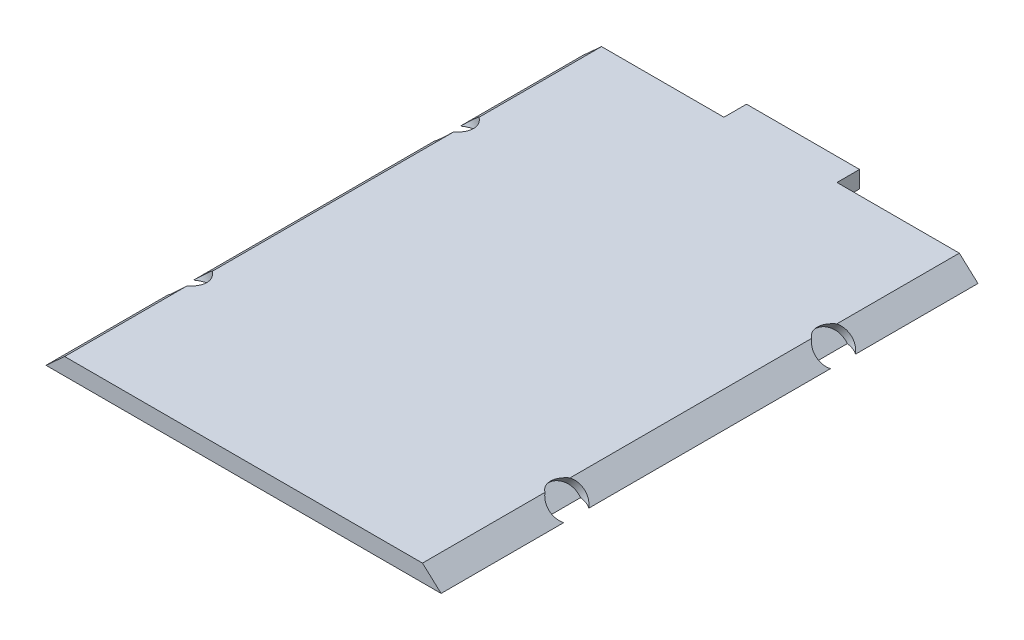
ISO-10303-21;
HEADER;
FILE_DESCRIPTION(('STEP AP214'),'2;1');
FILE_NAME('part.step','',(''),(''),'','','');
FILE_SCHEMA(('AUTOMOTIVE_DESIGN { 1 0 10303 214 1 1 1 1 }'));
ENDSEC;
DATA;
#1=APPLICATION_CONTEXT('core data for automotive mechanical design processes');
#2=APPLICATION_PROTOCOL_DEFINITION('international standard','automotive_design',2000,#1);
#3=PRODUCT_CONTEXT('',#1,'mechanical');
#4=PRODUCT('Part','Part','',(#3));
#5=PRODUCT_RELATED_PRODUCT_CATEGORY('part','',(#4));
#6=PRODUCT_DEFINITION_FORMATION('','',#4);
#7=PRODUCT_DEFINITION_CONTEXT('part definition',#1,'design');
#8=PRODUCT_DEFINITION('design','',#6,#7);
#9=PRODUCT_DEFINITION_SHAPE('','',#8);
#10=(LENGTH_UNIT() NAMED_UNIT(*) SI_UNIT(.MILLI.,.METRE.));
#11=(NAMED_UNIT(*) PLANE_ANGLE_UNIT() SI_UNIT($,.RADIAN.));
#12=(NAMED_UNIT(*) SI_UNIT($,.STERADIAN.) SOLID_ANGLE_UNIT());
#13=UNCERTAINTY_MEASURE_WITH_UNIT(LENGTH_MEASURE(1.E-05),#10,'distance_accuracy_value','');
#14=(GEOMETRIC_REPRESENTATION_CONTEXT(3) GLOBAL_UNCERTAINTY_ASSIGNED_CONTEXT((#13)) GLOBAL_UNIT_ASSIGNED_CONTEXT((#10,
#11,#12)) REPRESENTATION_CONTEXT('',''));
#15=CARTESIAN_POINT('',(0.,0.,0.));
#16=DIRECTION('',(0.,0.,1.));
#17=DIRECTION('',(1.,0.,0.));
#18=AXIS2_PLACEMENT_3D('',#15,#16,#17);
#19=CARTESIAN_POINT('',(40.2038837694651,5.93778829627168,120.65));
#20=DIRECTION('',(-0.672307408747508,-0.740272077106257,0.));
#21=DIRECTION('',(0.740272077106257,-0.672307408747508,0.));
#22=AXIS2_PLACEMENT_3D('',#19,#20,#21);
#23=PLANE('',#22);
#24=DIRECTION('',(0.,0.,-1.));
#25=VECTOR('',#24,1.);
#26=CARTESIAN_POINT('',(44.39904297354,2.12778829627168,120.65));
#27=LINE('',#26,#25);
#28=CARTESIAN_POINT('',(44.39904297354,2.12778829627169,87.4736801787405));
#29=VERTEX_POINT('',#28);
#30=CARTESIAN_POINT('',(44.39904297354,2.12778829627169,33.1763198212595));
#31=VERTEX_POINT('',#30);
#32=EDGE_CURVE('E191',#29,#31,#27,.T.);
#33=ORIENTED_EDGE('',*,*,#32,.T.);
#34=CARTESIAN_POINT('',(42.3014633715025,4.03278829627169,30.353));
#35=DIRECTION('',(0.672307408747507,0.740272077106257,0.));
#36=DIRECTION('',(0.740272077106257,-0.672307408747507,0.));
#37=AXIS2_PLACEMENT_3D('',#34,#35,#36);
#38=CIRCLE('',#37,4.00000000000002);
#39=CARTESIAN_POINT('',(40.2038837694651,5.93778829627168,33.1763198212595));
#40=VERTEX_POINT('',#39);
#41=EDGE_CURVE('E184',#40,#31,#38,.T.);
#42=ORIENTED_EDGE('',*,*,#41,.F.);
#43=DIRECTION('',(0.,0.,-1.));
#44=VECTOR('',#43,1.);
#45=CARTESIAN_POINT('',(40.2038837694651,5.93778829627168,120.65));
#46=LINE('',#45,#44);
#47=CARTESIAN_POINT('',(40.2038837694651,5.93778829627168,87.4736801787405));
#48=VERTEX_POINT('',#47);
#49=EDGE_CURVE('E197',#48,#40,#46,.T.);
#50=ORIENTED_EDGE('',*,*,#49,.F.);
#51=CARTESIAN_POINT('',(42.3014633715025,4.03278829627169,90.297));
#52=DIRECTION('',(0.672307408747507,0.740272077106257,0.));
#53=DIRECTION('',(-0.740272077106257,0.672307408747507,0.));
#54=AXIS2_PLACEMENT_3D('',#51,#52,#53);
#55=CIRCLE('',#54,4.00000000000002);
#56=EDGE_CURVE('E56',#29,#48,#55,.T.);
#57=ORIENTED_EDGE('',*,*,#56,.F.);
#58=EDGE_LOOP('',(#33,#42,#50,#57));
#59=FACE_BOUND('',#58,.T.);
#60=ADVANCED_FACE('F33',(#59),#23,.F.);
#61=CARTESIAN_POINT('',(44.39904297354,2.12778829627168,120.65));
#62=VERTEX_POINT('',#61);
#63=CARTESIAN_POINT('',(44.39904297354,2.12778829627169,93.1203198212595));
#64=VERTEX_POINT('',#63);
#65=EDGE_CURVE('E194',#62,#64,#27,.T.);
#66=ORIENTED_EDGE('',*,*,#65,.T.);
#67=CARTESIAN_POINT('',(40.2038837694651,5.93778829627168,93.1203198212595));
#68=VERTEX_POINT('',#67);
#69=EDGE_CURVE('E247',#68,#64,#55,.T.);
#70=ORIENTED_EDGE('',*,*,#69,.F.);
#71=CARTESIAN_POINT('',(40.2038837694651,5.93778829627168,120.65));
#72=VERTEX_POINT('',#71);
#73=EDGE_CURVE('E192',#72,#68,#46,.T.);
#74=ORIENTED_EDGE('',*,*,#73,.F.);
#75=DIRECTION('',(-0.740272077106257,0.672307408747507,0.));
#76=VECTOR('',#75,1.);
#77=CARTESIAN_POINT('',(40.2038837694651,5.93778829627168,120.65));
#78=LINE('',#77,#76);
#79=EDGE_CURVE('E304',#62,#72,#78,.T.);
#80=ORIENTED_EDGE('',*,*,#79,.F.);
#81=EDGE_LOOP('',(#66,#70,#74,#80));
#82=FACE_BOUND('',#81,.T.);
#83=ADVANCED_FACE('F360',(#82),#23,.F.);
#84=CARTESIAN_POINT('',(-40.2038837694651,5.93778829627168,120.65));
#85=DIRECTION('',(0.672307408747508,-0.740272077106257,0.));
#86=DIRECTION('',(0.740272077106257,0.672307408747508,0.));
#87=AXIS2_PLACEMENT_3D('',#84,#85,#86);
#88=PLANE('',#87);
#89=DIRECTION('',(0.,0.,-1.));
#90=VECTOR('',#89,1.);
#91=CARTESIAN_POINT('',(-40.2038837694651,5.93778829627168,120.65));
#92=LINE('',#91,#90);
#93=CARTESIAN_POINT('',(-40.2038837694651,5.93778829627168,120.65));
#94=VERTEX_POINT('',#93);
#95=CARTESIAN_POINT('',(-40.2038837694651,5.93778829627168,93.1203198212595));
#96=VERTEX_POINT('',#95);
#97=EDGE_CURVE('E317',#94,#96,#92,.T.);
#98=ORIENTED_EDGE('',*,*,#97,.T.);
#99=CARTESIAN_POINT('',(-42.3014633715025,4.03278829627169,90.297));
#100=DIRECTION('',(-0.672307408747507,0.740272077106257,0.));
#101=DIRECTION('',(0.740272077106257,0.672307408747507,0.));
#102=AXIS2_PLACEMENT_3D('',#99,#100,#101);
#103=CIRCLE('',#102,4.);
#104=CARTESIAN_POINT('',(-44.39904297354,2.12778829627168,93.1203198212594));
#105=VERTEX_POINT('',#104);
#106=EDGE_CURVE('E258',#105,#96,#103,.T.);
#107=ORIENTED_EDGE('',*,*,#106,.F.);
#108=DIRECTION('',(0.,0.,-1.));
#109=VECTOR('',#108,1.);
#110=CARTESIAN_POINT('',(-44.39904297354,2.12778829627168,120.65));
#111=LINE('',#110,#109);
#112=CARTESIAN_POINT('',(-44.39904297354,2.12778829627168,120.65));
#113=VERTEX_POINT('',#112);
#114=EDGE_CURVE('E207',#113,#105,#111,.T.);
#115=ORIENTED_EDGE('',*,*,#114,.F.);
#116=DIRECTION('',(-0.740272077106257,-0.672307408747507,0.));
#117=VECTOR('',#116,1.);
#118=CARTESIAN_POINT('',(-40.2038837694651,5.93778829627168,120.65));
#119=LINE('',#118,#117);
#120=EDGE_CURVE('E298',#94,#113,#119,.T.);
#121=ORIENTED_EDGE('',*,*,#120,.F.);
#122=EDGE_LOOP('',(#98,#107,#115,#121));
#123=FACE_BOUND('',#122,.T.);
#124=ADVANCED_FACE('F353',(#123),#88,.F.);
#125=CARTESIAN_POINT('',(-44.39904297354,2.12778829627168,87.4736801787406));
#126=VERTEX_POINT('',#125);
#127=CARTESIAN_POINT('',(-44.39904297354,2.12778829627168,33.1763198212594));
#128=VERTEX_POINT('',#127);
#129=EDGE_CURVE('E206',#126,#128,#111,.T.);
#130=ORIENTED_EDGE('',*,*,#129,.F.);
#131=CARTESIAN_POINT('',(-40.2038837694651,5.93778829627168,87.4736801787405));
#132=VERTEX_POINT('',#131);
#133=EDGE_CURVE('E256',#132,#126,#103,.T.);
#134=ORIENTED_EDGE('',*,*,#133,.F.);
#135=CARTESIAN_POINT('',(-40.2038837694651,5.93778829627168,33.1763198212595));
#136=VERTEX_POINT('',#135);
#137=EDGE_CURVE('E319',#132,#136,#92,.T.);
#138=ORIENTED_EDGE('',*,*,#137,.T.);
#139=CARTESIAN_POINT('',(-42.3014633715025,4.03278829627169,30.353));
#140=DIRECTION('',(-0.672307408747507,0.740272077106257,0.));
#141=DIRECTION('',(-0.740272077106257,-0.672307408747507,0.));
#142=AXIS2_PLACEMENT_3D('',#139,#140,#141);
#143=CIRCLE('',#142,4.);
#144=EDGE_CURVE('E266',#128,#136,#143,.T.);
#145=ORIENTED_EDGE('',*,*,#144,.F.);
#146=EDGE_LOOP('',(#130,#134,#138,#145));
#147=FACE_BOUND('',#146,.T.);
#148=ADVANCED_FACE('F347',(#147),#88,.F.);
#149=CARTESIAN_POINT('',(0.,0.,0.));
#150=DIRECTION('',(0.,0.,1.));
#151=DIRECTION('',(1.,0.,0.));
#152=AXIS2_PLACEMENT_3D('',#149,#150,#151);
#153=PLANE('',#152);
#154=DIRECTION('',(0.,-1.,0.));
#155=VECTOR('',#154,1.);
#156=CARTESIAN_POINT('',(12.7,5.93778829627168,0.));
#157=LINE('',#156,#155);
#158=CARTESIAN_POINT('',(12.7,5.93778829627168,0.));
#159=VERTEX_POINT('',#158);
#160=CARTESIAN_POINT('',(12.7,2.12778829627168,0.));
#161=VERTEX_POINT('',#160);
#162=EDGE_CURVE('E293',#159,#161,#157,.T.);
#163=ORIENTED_EDGE('',*,*,#162,.F.);
#164=DIRECTION('',(-1.,0.,0.));
#165=VECTOR('',#164,1.);
#166=CARTESIAN_POINT('',(-40.2038837694651,5.93778829627168,0.));
#167=LINE('',#166,#165);
#168=CARTESIAN_POINT('',(40.2038837694651,5.93778829627168,0.));
#169=VERTEX_POINT('',#168);
#170=EDGE_CURVE('E302',#169,#159,#167,.T.);
#171=ORIENTED_EDGE('',*,*,#170,.F.);
#172=DIRECTION('',(-0.740272077106257,0.672307408747507,0.));
#173=VECTOR('',#172,1.);
#174=CARTESIAN_POINT('',(40.2038837694651,5.93778829627168,0.));
#175=LINE('',#174,#173);
#176=CARTESIAN_POINT('',(44.39904297354,2.12778829627168,0.));
#177=VERTEX_POINT('',#176);
#178=EDGE_CURVE('E313',#177,#169,#175,.T.);
#179=ORIENTED_EDGE('',*,*,#178,.F.);
#180=DIRECTION('',(1.,0.,0.));
#181=VECTOR('',#180,1.);
#182=CARTESIAN_POINT('',(-44.39904297354,2.12778829627168,0.));
#183=LINE('',#182,#181);
#184=EDGE_CURVE('E189',#161,#177,#183,.T.);
#185=ORIENTED_EDGE('',*,*,#184,.F.);
#186=EDGE_LOOP('',(#163,#171,#179,#185));
#187=FACE_BOUND('',#186,.T.);
#188=ADVANCED_FACE('F344',(#187),#153,.F.);
#189=CARTESIAN_POINT('',(-44.39904297354,2.12778829627168,27.5296801787406));
#190=VERTEX_POINT('',#189);
#191=CARTESIAN_POINT('',(-44.39904297354,2.12778829627168,0.));
#192=VERTEX_POINT('',#191);
#193=EDGE_CURVE('E201',#190,#192,#111,.T.);
#194=ORIENTED_EDGE('',*,*,#193,.F.);
#195=CARTESIAN_POINT('',(-40.2038837694651,5.93778829627168,27.5296801787406));
#196=VERTEX_POINT('',#195);
#197=EDGE_CURVE('E269',#196,#190,#143,.T.);
#198=ORIENTED_EDGE('',*,*,#197,.F.);
#199=CARTESIAN_POINT('',(-40.2038837694651,5.93778829627168,0.));
#200=VERTEX_POINT('',#199);
#201=EDGE_CURVE('E308',#196,#200,#92,.T.);
#202=ORIENTED_EDGE('',*,*,#201,.T.);
#203=DIRECTION('',(-0.740272077106257,-0.672307408747507,0.));
#204=VECTOR('',#203,1.);
#205=CARTESIAN_POINT('',(-40.2038837694651,5.93778829627168,0.));
#206=LINE('',#205,#204);
#207=EDGE_CURVE('E292',#200,#192,#206,.T.);
#208=ORIENTED_EDGE('',*,*,#207,.T.);
#209=EDGE_LOOP('',(#194,#198,#202,#208));
#210=FACE_BOUND('',#209,.T.);
#211=ADVANCED_FACE('F35',(#210),#88,.F.);
#212=CARTESIAN_POINT('',(-44.39904297354,2.12778829627168,120.65));
#213=DIRECTION('',(0.,1.,0.));
#214=DIRECTION('',(0.,0.,1.));
#215=AXIS2_PLACEMENT_3D('',#212,#213,#214);
#216=PLANE('',#215);
#217=CARTESIAN_POINT('',(44.39904297354,2.12778829627169,27.5296801787405));
#218=VERTEX_POINT('',#217);
#219=EDGE_CURVE('E181',#218,#177,#27,.T.);
#220=ORIENTED_EDGE('',*,*,#219,.F.);
#221=CARTESIAN_POINT('',(40.5713621651049,2.12778829627168,30.353));
#222=DIRECTION('',(0.,1.,0.));
#223=DIRECTION('',(1.,0.,0.));
#224=AXIS2_PLACEMENT_3D('',#221,#222,#223);
#225=ELLIPSE('',#224,5.40341872090613,4.00000000000002);
#226=CARTESIAN_POINT('',(41.4242133435558,2.12778829627168,26.4031383076787));
#227=VERTEX_POINT('',#226);
#228=EDGE_CURVE('E169',#218,#227,#225,.T.);
#229=ORIENTED_EDGE('',*,*,#228,.T.);
#230=DIRECTION('',(0.,0.,1.));
#231=VECTOR('',#230,1.);
#232=CARTESIAN_POINT('',(41.4242133435558,2.12778829627168,120.65));
#233=LINE('',#232,#231);
#234=CARTESIAN_POINT('',(41.4242133435558,2.12778829627168,34.3028616923213));
#235=VERTEX_POINT('',#234);
#236=EDGE_CURVE('E11',#227,#235,#233,.T.);
#237=ORIENTED_EDGE('',*,*,#236,.T.);
#238=EDGE_CURVE('E175',#235,#31,#225,.T.);
#239=ORIENTED_EDGE('',*,*,#238,.T.);
#240=ORIENTED_EDGE('',*,*,#32,.F.);
#241=CARTESIAN_POINT('',(40.5713621651049,2.12778829627168,90.297));
#242=DIRECTION('',(0.,1.,0.));
#243=DIRECTION('',(1.,0.,0.));
#244=AXIS2_PLACEMENT_3D('',#241,#242,#243);
#245=ELLIPSE('',#244,5.40341872090613,4.00000000000002);
#246=CARTESIAN_POINT('',(41.4242133435558,2.12778829627168,86.3471383076787));
#247=VERTEX_POINT('',#246);
#248=EDGE_CURVE('E251',#29,#247,#245,.T.);
#249=ORIENTED_EDGE('',*,*,#248,.T.);
#250=DIRECTION('',(0.,0.,-1.));
#251=VECTOR('',#250,1.);
#252=CARTESIAN_POINT('',(41.4242133435558,2.12778829627168,120.65));
#253=LINE('',#252,#251);
#254=CARTESIAN_POINT('',(41.4242133435558,2.12778829627168,94.2468616923213));
#255=VERTEX_POINT('',#254);
#256=EDGE_CURVE('E232',#255,#247,#253,.T.);
#257=ORIENTED_EDGE('',*,*,#256,.F.);
#258=EDGE_CURVE('E246',#255,#64,#245,.T.);
#259=ORIENTED_EDGE('',*,*,#258,.T.);
#260=ORIENTED_EDGE('',*,*,#65,.F.);
#261=DIRECTION('',(1.,0.,0.));
#262=VECTOR('',#261,1.);
#263=CARTESIAN_POINT('',(-44.39904297354,2.12778829627168,120.65));
#264=LINE('',#263,#262);
#265=EDGE_CURVE('E301',#113,#62,#264,.T.);
#266=ORIENTED_EDGE('',*,*,#265,.F.);
#267=ORIENTED_EDGE('',*,*,#114,.T.);
#268=CARTESIAN_POINT('',(-40.5713621651049,2.12778829627168,90.297));
#269=DIRECTION('',(0.,1.,0.));
#270=DIRECTION('',(-1.,0.,0.));
#271=AXIS2_PLACEMENT_3D('',#268,#269,#270);
#272=ELLIPSE('',#271,5.40341872090611,4.);
#273=CARTESIAN_POINT('',(-41.4242133435558,2.12778829627168,94.2468616923213));
#274=VERTEX_POINT('',#273);
#275=EDGE_CURVE('E261',#105,#274,#272,.T.);
#276=ORIENTED_EDGE('',*,*,#275,.T.);
#277=DIRECTION('',(0.,0.,-1.));
#278=VECTOR('',#277,1.);
#279=CARTESIAN_POINT('',(-41.4242133435558,2.12778829627168,120.65));
#280=LINE('',#279,#278);
#281=CARTESIAN_POINT('',(-41.4242133435558,2.12778829627168,86.3471383076787));
#282=VERTEX_POINT('',#281);
#283=EDGE_CURVE('E227',#274,#282,#280,.T.);
#284=ORIENTED_EDGE('',*,*,#283,.T.);
#285=EDGE_CURVE('E255',#282,#126,#272,.T.);
#286=ORIENTED_EDGE('',*,*,#285,.T.);
#287=ORIENTED_EDGE('',*,*,#129,.T.);
#288=CARTESIAN_POINT('',(-40.5713621651049,2.12778829627168,30.353));
#289=DIRECTION('',(0.,1.,0.));
#290=DIRECTION('',(-1.,0.,0.));
#291=AXIS2_PLACEMENT_3D('',#288,#289,#290);
#292=ELLIPSE('',#291,5.40341872090611,4.);
#293=CARTESIAN_POINT('',(-41.4242133435558,2.12778829627168,34.3028616923213));
#294=VERTEX_POINT('',#293);
#295=EDGE_CURVE('E271',#128,#294,#292,.T.);
#296=ORIENTED_EDGE('',*,*,#295,.T.);
#297=DIRECTION('',(0.,0.,1.));
#298=VECTOR('',#297,1.);
#299=CARTESIAN_POINT('',(-41.4242133435558,2.12778829627168,120.65));
#300=LINE('',#299,#298);
#301=CARTESIAN_POINT('',(-41.4242133435558,2.12778829627168,26.4031383076787));
#302=VERTEX_POINT('',#301);
#303=EDGE_CURVE('E218',#302,#294,#300,.T.);
#304=ORIENTED_EDGE('',*,*,#303,.F.);
#305=EDGE_CURVE('E265',#302,#190,#292,.T.);
#306=ORIENTED_EDGE('',*,*,#305,.T.);
#307=ORIENTED_EDGE('',*,*,#193,.T.);
#308=CARTESIAN_POINT('',(-12.7,2.12778829627168,0.));
#309=VERTEX_POINT('',#308);
#310=EDGE_CURVE('E311',#192,#309,#183,.T.);
#311=ORIENTED_EDGE('',*,*,#310,.T.);
#312=DIRECTION('',(0.,0.,-1.));
#313=VECTOR('',#312,1.);
#314=CARTESIAN_POINT('',(-12.7,2.12778829627168,0.));
#315=LINE('',#314,#313);
#316=CARTESIAN_POINT('',(-12.7,2.12778829627168,-5.08));
#317=VERTEX_POINT('',#316);
#318=EDGE_CURVE('E282',#309,#317,#315,.T.);
#319=ORIENTED_EDGE('',*,*,#318,.T.);
#320=DIRECTION('',(1.,0.,0.));
#321=VECTOR('',#320,1.);
#322=CARTESIAN_POINT('',(-12.7,2.12778829627168,-5.08));
#323=LINE('',#322,#321);
#324=CARTESIAN_POINT('',(12.7,2.12778829627168,-5.08));
#325=VERTEX_POINT('',#324);
#326=EDGE_CURVE('E285',#317,#325,#323,.T.);
#327=ORIENTED_EDGE('',*,*,#326,.T.);
#328=DIRECTION('',(0.,0.,1.));
#329=VECTOR('',#328,1.);
#330=CARTESIAN_POINT('',(12.7,2.12778829627168,0.));
#331=LINE('',#330,#329);
#332=EDGE_CURVE('E276',#325,#161,#331,.T.);
#333=ORIENTED_EDGE('',*,*,#332,.T.);
#334=ORIENTED_EDGE('',*,*,#184,.T.);
#335=EDGE_LOOP('',(#220,#229,#237,#239,#240,#249,#257,#259,#260,#266,#267,#276,#284,#286,#287,
#296,#304,#306,#307,#311,#319,#327,#333,#334));
#336=FACE_BOUND('',#335,.T.);
#337=ADVANCED_FACE('F186',(#336),#216,.F.);
#338=CARTESIAN_POINT('',(40.2038837694651,5.93778829627168,27.5296801787406));
#339=VERTEX_POINT('',#338);
#340=EDGE_CURVE('E183',#339,#169,#46,.T.);
#341=ORIENTED_EDGE('',*,*,#340,.F.);
#342=EDGE_CURVE('E48',#218,#339,#38,.T.);
#343=ORIENTED_EDGE('',*,*,#342,.F.);
#344=ORIENTED_EDGE('',*,*,#219,.T.);
#345=ORIENTED_EDGE('',*,*,#178,.T.);
#346=EDGE_LOOP('',(#341,#343,#344,#345));
#347=FACE_BOUND('',#346,.T.);
#348=ADVANCED_FACE('F179',(#347),#23,.F.);
#349=CARTESIAN_POINT('',(-40.2038837694651,5.93778829627168,120.65));
#350=DIRECTION('',(0.,-1.,0.));
#351=DIRECTION('',(0.,0.,-1.));
#352=AXIS2_PLACEMENT_3D('',#349,#350,#351);
#353=PLANE('',#352);
#354=ORIENTED_EDGE('',*,*,#49,.T.);
#355=CARTESIAN_POINT('',(44.0315645779001,5.93778829627168,30.353));
#356=DIRECTION('',(0.,-1.,0.));
#357=DIRECTION('',(1.,0.,0.));
#358=AXIS2_PLACEMENT_3D('',#355,#356,#357);
#359=ELLIPSE('',#358,5.40341872090613,4.00000000000002);
#360=EDGE_CURVE('E41',#40,#339,#359,.T.);
#361=ORIENTED_EDGE('',*,*,#360,.T.);
#362=ORIENTED_EDGE('',*,*,#340,.T.);
#363=ORIENTED_EDGE('',*,*,#170,.T.);
#364=DIRECTION('',(0.,0.,1.));
#365=VECTOR('',#364,1.);
#366=CARTESIAN_POINT('',(12.7,5.93778829627168,0.));
#367=LINE('',#366,#365);
#368=CARTESIAN_POINT('',(12.7,5.93778829627168,-5.08));
#369=VERTEX_POINT('',#368);
#370=EDGE_CURVE('E279',#369,#159,#367,.T.);
#371=ORIENTED_EDGE('',*,*,#370,.F.);
#372=DIRECTION('',(1.,0.,0.));
#373=VECTOR('',#372,1.);
#374=CARTESIAN_POINT('',(-12.7,5.93778829627168,-5.08));
#375=LINE('',#374,#373);
#376=CARTESIAN_POINT('',(-12.7,5.93778829627168,-5.08));
#377=VERTEX_POINT('',#376);
#378=EDGE_CURVE('E275',#377,#369,#375,.T.);
#379=ORIENTED_EDGE('',*,*,#378,.F.);
#380=DIRECTION('',(0.,0.,-1.));
#381=VECTOR('',#380,1.);
#382=CARTESIAN_POINT('',(-12.7,5.93778829627168,0.));
#383=LINE('',#382,#381);
#384=CARTESIAN_POINT('',(-12.7,5.93778829627168,0.));
#385=VERTEX_POINT('',#384);
#386=EDGE_CURVE('E272',#385,#377,#383,.T.);
#387=ORIENTED_EDGE('',*,*,#386,.F.);
#388=EDGE_CURVE('E315',#385,#200,#167,.T.);
#389=ORIENTED_EDGE('',*,*,#388,.T.);
#390=ORIENTED_EDGE('',*,*,#201,.F.);
#391=CARTESIAN_POINT('',(-44.0315645779001,5.93778829627168,30.353));
#392=DIRECTION('',(0.,-1.,0.));
#393=DIRECTION('',(-1.,0.,0.));
#394=AXIS2_PLACEMENT_3D('',#391,#392,#393);
#395=ELLIPSE('',#394,5.40341872090611,4.);
#396=EDGE_CURVE('E214',#196,#136,#395,.T.);
#397=ORIENTED_EDGE('',*,*,#396,.T.);
#398=ORIENTED_EDGE('',*,*,#137,.F.);
#399=CARTESIAN_POINT('',(-44.0315645779001,5.93778829627168,90.297));
#400=DIRECTION('',(0.,-1.,0.));
#401=DIRECTION('',(-1.,0.,0.));
#402=AXIS2_PLACEMENT_3D('',#399,#400,#401);
#403=ELLIPSE('',#402,5.40341872090611,4.);
#404=EDGE_CURVE('E222',#132,#96,#403,.T.);
#405=ORIENTED_EDGE('',*,*,#404,.T.);
#406=ORIENTED_EDGE('',*,*,#97,.F.);
#407=DIRECTION('',(-1.,0.,0.));
#408=VECTOR('',#407,1.);
#409=CARTESIAN_POINT('',(-40.2038837694651,5.93778829627168,120.65));
#410=LINE('',#409,#408);
#411=EDGE_CURVE('E306',#72,#94,#410,.T.);
#412=ORIENTED_EDGE('',*,*,#411,.F.);
#413=ORIENTED_EDGE('',*,*,#73,.T.);
#414=CARTESIAN_POINT('',(44.0315645779001,5.93778829627168,90.297));
#415=DIRECTION('',(0.,-1.,0.));
#416=DIRECTION('',(1.,0.,0.));
#417=AXIS2_PLACEMENT_3D('',#414,#415,#416);
#418=ELLIPSE('',#417,5.40341872090613,4.00000000000002);
#419=EDGE_CURVE('E230',#68,#48,#418,.T.);
#420=ORIENTED_EDGE('',*,*,#419,.T.);
#421=EDGE_LOOP('',(#354,#361,#362,#363,#371,#379,#387,#389,#390,#397,#398,#405,#406,#412,#413,#420));
#422=FACE_BOUND('',#421,.T.);
#423=ADVANCED_FACE('F234',(#422),#353,.F.);
#424=CARTESIAN_POINT('',(0.,0.,120.65));
#425=DIRECTION('',(0.,0.,1.));
#426=DIRECTION('',(1.,0.,0.));
#427=AXIS2_PLACEMENT_3D('',#424,#425,#426);
#428=PLANE('',#427);
#429=ORIENTED_EDGE('',*,*,#120,.T.);
#430=ORIENTED_EDGE('',*,*,#265,.T.);
#431=ORIENTED_EDGE('',*,*,#79,.T.);
#432=ORIENTED_EDGE('',*,*,#411,.T.);
#433=EDGE_LOOP('',(#429,#430,#431,#432));
#434=FACE_BOUND('',#433,.T.);
#435=ADVANCED_FACE('F358',(#434),#428,.T.);
#436=ORIENTED_EDGE('',*,*,#388,.F.);
#437=DIRECTION('',(0.,-1.,0.));
#438=VECTOR('',#437,1.);
#439=CARTESIAN_POINT('',(-12.7,5.93778829627168,0.));
#440=LINE('',#439,#438);
#441=EDGE_CURVE('E289',#385,#309,#440,.T.);
#442=ORIENTED_EDGE('',*,*,#441,.T.);
#443=ORIENTED_EDGE('',*,*,#310,.F.);
#444=ORIENTED_EDGE('',*,*,#207,.F.);
#445=EDGE_LOOP('',(#436,#442,#443,#444));
#446=FACE_BOUND('',#445,.T.);
#447=ADVANCED_FACE('F332',(#446),#153,.F.);
#448=CARTESIAN_POINT('',(-12.7,5.93778829627168,0.));
#449=DIRECTION('',(-1.,0.,0.));
#450=DIRECTION('',(0.,0.,1.));
#451=AXIS2_PLACEMENT_3D('',#448,#449,#450);
#452=PLANE('',#451);
#453=ORIENTED_EDGE('',*,*,#318,.F.);
#454=ORIENTED_EDGE('',*,*,#441,.F.);
#455=ORIENTED_EDGE('',*,*,#386,.T.);
#456=DIRECTION('',(0.,-1.,0.));
#457=VECTOR('',#456,1.);
#458=CARTESIAN_POINT('',(-12.7,5.93778829627168,-5.08));
#459=LINE('',#458,#457);
#460=EDGE_CURVE('E281',#377,#317,#459,.T.);
#461=ORIENTED_EDGE('',*,*,#460,.T.);
#462=EDGE_LOOP('',(#453,#454,#455,#461));
#463=FACE_BOUND('',#462,.T.);
#464=ADVANCED_FACE('F335',(#463),#452,.T.);
#465=CARTESIAN_POINT('',(12.7,5.93778829627168,0.));
#466=DIRECTION('',(1.,0.,0.));
#467=DIRECTION('',(0.,0.,-1.));
#468=AXIS2_PLACEMENT_3D('',#465,#466,#467);
#469=PLANE('',#468);
#470=ORIENTED_EDGE('',*,*,#332,.F.);
#471=DIRECTION('',(0.,-1.,0.));
#472=VECTOR('',#471,1.);
#473=CARTESIAN_POINT('',(12.7,5.93778829627168,-5.08));
#474=LINE('',#473,#472);
#475=EDGE_CURVE('E295',#369,#325,#474,.T.);
#476=ORIENTED_EDGE('',*,*,#475,.F.);
#477=ORIENTED_EDGE('',*,*,#370,.T.);
#478=ORIENTED_EDGE('',*,*,#162,.T.);
#479=EDGE_LOOP('',(#470,#476,#477,#478));
#480=FACE_BOUND('',#479,.T.);
#481=ADVANCED_FACE('F341',(#480),#469,.T.);
#482=CARTESIAN_POINT('',(-12.7,5.93778829627168,-5.08));
#483=DIRECTION('',(0.,0.,-1.));
#484=DIRECTION('',(-1.,0.,0.));
#485=AXIS2_PLACEMENT_3D('',#482,#483,#484);
#486=PLANE('',#485);
#487=ORIENTED_EDGE('',*,*,#326,.F.);
#488=ORIENTED_EDGE('',*,*,#460,.F.);
#489=ORIENTED_EDGE('',*,*,#378,.T.);
#490=ORIENTED_EDGE('',*,*,#475,.T.);
#491=EDGE_LOOP('',(#487,#488,#489,#490));
#492=FACE_BOUND('',#491,.T.);
#493=ADVANCED_FACE('F337',(#492),#486,.T.);
#494=CARTESIAN_POINT('',(-40.9568485540075,2.55224414205918,30.353));
#495=DIRECTION('',(-0.672307408747507,0.740272077106257,0.));
#496=DIRECTION('',(-0.740272077106257,-0.672307408747507,0.));
#497=AXIS2_PLACEMENT_3D('',#494,#495,#496);
#498=PLANE('',#497);
#499=ORIENTED_EDGE('',*,*,#303,.T.);
#500=CARTESIAN_POINT('',(-40.9568485540075,2.55224414205918,30.353));
#501=DIRECTION('',(-0.672307408747507,0.740272077106257,0.));
#502=DIRECTION('',(-0.740272077106257,-0.672307408747507,0.));
#503=AXIS2_PLACEMENT_3D('',#500,#501,#502);
#504=CIRCLE('',#503,4.);
#505=EDGE_CURVE('E262',#294,#302,#504,.T.);
#506=ORIENTED_EDGE('',*,*,#505,.T.);
#507=EDGE_LOOP('',(#499,#506));
#508=FACE_BOUND('',#507,.T.);
#509=ADVANCED_FACE('F387',(#508),#498,.T.);
#510=CARTESIAN_POINT('',(-40.9568485540075,2.55224414205918,30.353));
#511=DIRECTION('',(-0.672307408747507,0.740272077106257,0.));
#512=DIRECTION('',(-0.740272077106257,-0.672307408747507,0.));
#513=AXIS2_PLACEMENT_3D('',#510,#511,#512);
#514=CYLINDRICAL_SURFACE('',#513,4.);
#515=ORIENTED_EDGE('',*,*,#144,.T.);
#516=ORIENTED_EDGE('',*,*,#396,.F.);
#517=ORIENTED_EDGE('',*,*,#197,.T.);
#518=ORIENTED_EDGE('',*,*,#305,.F.);
#519=ORIENTED_EDGE('',*,*,#505,.F.);
#520=ORIENTED_EDGE('',*,*,#295,.F.);
#521=EDGE_LOOP('',(#515,#516,#517,#518,#519,#520));
#522=FACE_BOUND('',#521,.T.);
#523=ADVANCED_FACE('F392',(#522),#514,.F.);
#524=CARTESIAN_POINT('',(-40.9568485540075,2.55224414205918,90.297));
#525=DIRECTION('',(0.672307408747507,-0.740272077106257,0.));
#526=DIRECTION('',(0.740272077106257,0.672307408747507,0.));
#527=AXIS2_PLACEMENT_3D('',#524,#525,#526);
#528=PLANE('',#527);
#529=CARTESIAN_POINT('',(-40.9568485540075,2.55224414205918,90.297));
#530=DIRECTION('',(-0.672307408747507,0.740272077106257,0.));
#531=DIRECTION('',(0.740272077106257,0.672307408747507,0.));
#532=AXIS2_PLACEMENT_3D('',#529,#530,#531);
#533=CIRCLE('',#532,4.);
#534=EDGE_CURVE('E252',#274,#282,#533,.T.);
#535=ORIENTED_EDGE('',*,*,#534,.T.);
#536=ORIENTED_EDGE('',*,*,#283,.F.);
#537=EDGE_LOOP('',(#535,#536));
#538=FACE_BOUND('',#537,.T.);
#539=ADVANCED_FACE('F404',(#538),#528,.F.);
#540=CARTESIAN_POINT('',(-40.9568485540075,2.55224414205918,90.297));
#541=DIRECTION('',(-0.672307408747507,0.740272077106257,0.));
#542=DIRECTION('',(-0.740272077106257,-0.672307408747507,0.));
#543=AXIS2_PLACEMENT_3D('',#540,#541,#542);
#544=CYLINDRICAL_SURFACE('',#543,4.);
#545=ORIENTED_EDGE('',*,*,#106,.T.);
#546=ORIENTED_EDGE('',*,*,#404,.F.);
#547=ORIENTED_EDGE('',*,*,#133,.T.);
#548=ORIENTED_EDGE('',*,*,#285,.F.);
#549=ORIENTED_EDGE('',*,*,#534,.F.);
#550=ORIENTED_EDGE('',*,*,#275,.F.);
#551=EDGE_LOOP('',(#545,#546,#547,#548,#549,#550));
#552=FACE_BOUND('',#551,.T.);
#553=ADVANCED_FACE('F414',(#552),#544,.F.);
#554=CARTESIAN_POINT('',(40.9568485540075,2.55224414205918,90.297));
#555=DIRECTION('',(0.672307408747507,0.740272077106257,0.));
#556=DIRECTION('',(-0.740272077106257,0.672307408747507,0.));
#557=AXIS2_PLACEMENT_3D('',#554,#555,#556);
#558=PLANE('',#557);
#559=ORIENTED_EDGE('',*,*,#256,.T.);
#560=CARTESIAN_POINT('',(40.9568485540075,2.55224414205918,90.297));
#561=DIRECTION('',(0.672307408747507,0.740272077106257,0.));
#562=DIRECTION('',(-0.740272077106257,0.672307408747507,0.));
#563=AXIS2_PLACEMENT_3D('',#560,#561,#562);
#564=CIRCLE('',#563,4.00000000000002);
#565=EDGE_CURVE('E243',#247,#255,#564,.T.);
#566=ORIENTED_EDGE('',*,*,#565,.T.);
#567=EDGE_LOOP('',(#559,#566));
#568=FACE_BOUND('',#567,.T.);
#569=ADVANCED_FACE('F423',(#568),#558,.T.);
#570=CARTESIAN_POINT('',(40.9568485540075,2.55224414205918,90.297));
#571=DIRECTION('',(0.672307408747507,0.740272077106257,0.));
#572=DIRECTION('',(-0.740272077106257,0.672307408747507,0.));
#573=AXIS2_PLACEMENT_3D('',#570,#571,#572);
#574=CYLINDRICAL_SURFACE('',#573,4.00000000000002);
#575=ORIENTED_EDGE('',*,*,#56,.T.);
#576=ORIENTED_EDGE('',*,*,#419,.F.);
#577=ORIENTED_EDGE('',*,*,#69,.T.);
#578=ORIENTED_EDGE('',*,*,#258,.F.);
#579=ORIENTED_EDGE('',*,*,#565,.F.);
#580=ORIENTED_EDGE('',*,*,#248,.F.);
#581=EDGE_LOOP('',(#575,#576,#577,#578,#579,#580));
#582=FACE_BOUND('',#581,.T.);
#583=ADVANCED_FACE('F499',(#582),#574,.F.);
#584=CARTESIAN_POINT('',(40.9568485540075,2.55224414205918,30.353));
#585=DIRECTION('',(-0.672307408747507,-0.740272077106257,0.));
#586=DIRECTION('',(0.740272077106257,-0.672307408747507,0.));
#587=AXIS2_PLACEMENT_3D('',#584,#585,#586);
#588=PLANE('',#587);
#589=CARTESIAN_POINT('',(40.9568485540075,2.55224414205918,30.353));
#590=DIRECTION('',(0.672307408747507,0.740272077106257,0.));
#591=DIRECTION('',(0.740272077106257,-0.672307408747507,0.));
#592=AXIS2_PLACEMENT_3D('',#589,#590,#591);
#593=CIRCLE('',#592,4.00000000000002);
#594=EDGE_CURVE('E172',#227,#235,#593,.T.);
#595=ORIENTED_EDGE('',*,*,#594,.T.);
#596=ORIENTED_EDGE('',*,*,#236,.F.);
#597=EDGE_LOOP('',(#595,#596));
#598=FACE_BOUND('',#597,.T.);
#599=ADVANCED_FACE('F509',(#598),#588,.F.);
#600=CARTESIAN_POINT('',(40.9568485540075,2.55224414205918,30.353));
#601=DIRECTION('',(0.672307408747507,0.740272077106257,0.));
#602=DIRECTION('',(-0.740272077106257,0.672307408747507,0.));
#603=AXIS2_PLACEMENT_3D('',#600,#601,#602);
#604=CYLINDRICAL_SURFACE('',#603,4.00000000000002);
#605=ORIENTED_EDGE('',*,*,#342,.T.);
#606=ORIENTED_EDGE('',*,*,#360,.F.);
#607=ORIENTED_EDGE('',*,*,#41,.T.);
#608=ORIENTED_EDGE('',*,*,#238,.F.);
#609=ORIENTED_EDGE('',*,*,#594,.F.);
#610=ORIENTED_EDGE('',*,*,#228,.F.);
#611=EDGE_LOOP('',(#605,#606,#607,#608,#609,#610));
#612=FACE_BOUND('',#611,.T.);
#613=ADVANCED_FACE('F170',(#612),#604,.F.);
#614=CLOSED_SHELL('',(#60,#83,#124,#148,#188,#211,#337,#348,#423,#435,#447,#464,#481,#493,#509,
#523,#539,#553,#569,#583,#599,#613));
#615=MANIFOLD_SOLID_BREP('B2',#614);
#616=ADVANCED_BREP_SHAPE_REPRESENTATION('',(#18,#615),#14);
#617=SHAPE_DEFINITION_REPRESENTATION(#9,#616);
ENDSEC;
END-ISO-10303-21;
